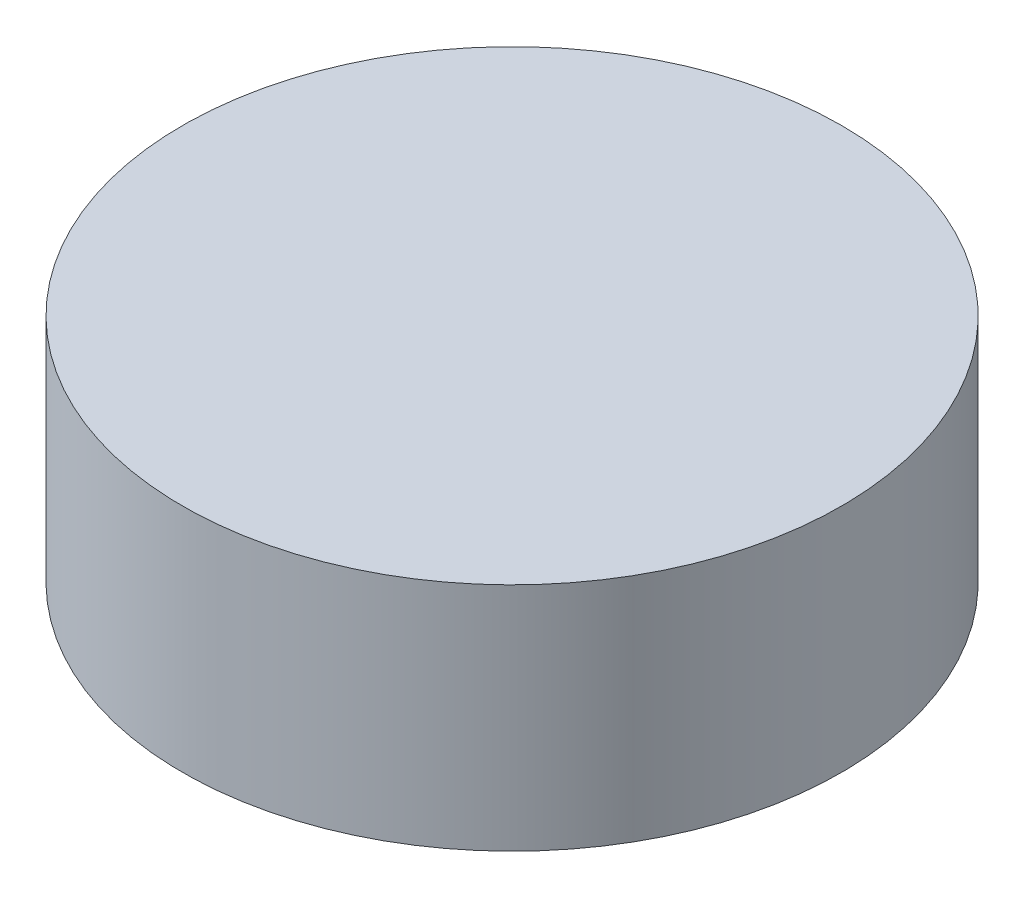
ISO-10303-21;
HEADER;
FILE_DESCRIPTION(('STEP AP214'),'2;1');
FILE_NAME('part.step','',(''),(''),'','','');
FILE_SCHEMA(('AUTOMOTIVE_DESIGN { 1 0 10303 214 1 1 1 1 }'));
ENDSEC;
DATA;
#1=APPLICATION_CONTEXT('core data for automotive mechanical design processes');
#2=APPLICATION_PROTOCOL_DEFINITION('international standard','automotive_design',2000,#1);
#3=PRODUCT_CONTEXT('',#1,'mechanical');
#4=PRODUCT('Part','Part','',(#3));
#5=PRODUCT_RELATED_PRODUCT_CATEGORY('part','',(#4));
#6=PRODUCT_DEFINITION_FORMATION('','',#4);
#7=PRODUCT_DEFINITION_CONTEXT('part definition',#1,'design');
#8=PRODUCT_DEFINITION('design','',#6,#7);
#9=PRODUCT_DEFINITION_SHAPE('','',#8);
#10=(LENGTH_UNIT() NAMED_UNIT(*) SI_UNIT(.MILLI.,.METRE.));
#11=(NAMED_UNIT(*) PLANE_ANGLE_UNIT() SI_UNIT($,.RADIAN.));
#12=(NAMED_UNIT(*) SI_UNIT($,.STERADIAN.) SOLID_ANGLE_UNIT());
#13=UNCERTAINTY_MEASURE_WITH_UNIT(LENGTH_MEASURE(1.E-05),#10,'distance_accuracy_value','');
#14=(GEOMETRIC_REPRESENTATION_CONTEXT(3) GLOBAL_UNCERTAINTY_ASSIGNED_CONTEXT((#13)) GLOBAL_UNIT_ASSIGNED_CONTEXT((#10,
#11,#12)) REPRESENTATION_CONTEXT('',''));
#15=CARTESIAN_POINT('',(0.,0.,0.));
#16=DIRECTION('',(0.,0.,1.));
#17=DIRECTION('',(1.,0.,0.));
#18=AXIS2_PLACEMENT_3D('',#15,#16,#17);
#19=CARTESIAN_POINT('',(-74.9999999999997,32.,-129.903810567666));
#20=DIRECTION('',(0.,-1.,0.));
#21=DIRECTION('',(0.,0.,-1.));
#22=AXIS2_PLACEMENT_3D('',#19,#20,#21);
#23=CYLINDRICAL_SURFACE('',#22,20.);
#24=CARTESIAN_POINT('',(-74.9999999999997,32.,-129.903810567666));
#25=DIRECTION('',(0.,1.,0.));
#26=DIRECTION('',(0.,0.,1.));
#27=AXIS2_PLACEMENT_3D('',#24,#25,#26);
#28=CIRCLE('',#27,20.);
#29=CARTESIAN_POINT('',(-74.9999999999997,32.,-149.903810567666));
#30=VERTEX_POINT('',#29);
#31=EDGE_CURVE('E10',#30,#30,#28,.T.);
#32=CARTESIAN_POINT('',(-74.9999999999997,18.,-129.903810567666));
#33=DIRECTION('',(0.,1.,0.));
#34=DIRECTION('',(0.,0.,1.));
#35=AXIS2_PLACEMENT_3D('',#32,#33,#34);
#36=CIRCLE('',#35,20.);
#37=CARTESIAN_POINT('',(-74.9999999999997,18.,-149.903810567666));
#38=VERTEX_POINT('',#37);
#39=EDGE_CURVE('E40',#38,#38,#36,.T.);
#40=CARTESIAN_POINT('',(-74.9999999999997,32.,-149.903810567666));
#41=CARTESIAN_POINT('',(-74.9999999999997,31.8541666666667,-149.903810567666));
#42=CARTESIAN_POINT('',(-74.9999999999997,31.7083333333333,-149.903810567666));
#43=CARTESIAN_POINT('',(-74.9999999999997,31.4166666666667,-149.903810567666));
#44=CARTESIAN_POINT('',(-74.9999999999997,31.2708333333333,-149.903810567666));
#45=CARTESIAN_POINT('',(-74.9999999999997,30.9791666666667,-149.903810567666));
#46=CARTESIAN_POINT('',(-74.9999999999997,30.8333333333333,-149.903810567666));
#47=CARTESIAN_POINT('',(-74.9999999999997,30.5416666666667,-149.903810567666));
#48=CARTESIAN_POINT('',(-74.9999999999997,30.3958333333333,-149.903810567666));
#49=CARTESIAN_POINT('',(-74.9999999999997,30.1041666666667,-149.903810567666));
#50=CARTESIAN_POINT('',(-74.9999999999997,29.9583333333333,-149.903810567666));
#51=CARTESIAN_POINT('',(-74.9999999999997,29.6666666666667,-149.903810567666));
#52=CARTESIAN_POINT('',(-74.9999999999997,29.5208333333333,-149.903810567666));
#53=CARTESIAN_POINT('',(-74.9999999999997,29.2291666666667,-149.903810567666));
#54=CARTESIAN_POINT('',(-74.9999999999997,29.0833333333333,-149.903810567666));
#55=CARTESIAN_POINT('',(-74.9999999999997,28.7916666666667,-149.903810567666));
#56=CARTESIAN_POINT('',(-74.9999999999997,28.6458333333333,-149.903810567666));
#57=CARTESIAN_POINT('',(-74.9999999999997,28.3541666666667,-149.903810567666));
#58=CARTESIAN_POINT('',(-74.9999999999997,28.2083333333333,-149.903810567666));
#59=CARTESIAN_POINT('',(-74.9999999999997,27.9166666666667,-149.903810567666));
#60=CARTESIAN_POINT('',(-74.9999999999997,27.7708333333333,-149.903810567666));
#61=CARTESIAN_POINT('',(-74.9999999999997,27.4791666666667,-149.903810567666));
#62=CARTESIAN_POINT('',(-74.9999999999997,27.3333333333333,-149.903810567666));
#63=CARTESIAN_POINT('',(-74.9999999999997,27.0416666666667,-149.903810567666));
#64=CARTESIAN_POINT('',(-74.9999999999997,26.8958333333333,-149.903810567666));
#65=CARTESIAN_POINT('',(-74.9999999999997,26.6041666666667,-149.903810567666));
#66=CARTESIAN_POINT('',(-74.9999999999997,26.4583333333333,-149.903810567666));
#67=CARTESIAN_POINT('',(-74.9999999999997,26.1666666666667,-149.903810567666));
#68=CARTESIAN_POINT('',(-74.9999999999997,26.0208333333333,-149.903810567666));
#69=CARTESIAN_POINT('',(-74.9999999999997,25.7291666666667,-149.903810567666));
#70=CARTESIAN_POINT('',(-74.9999999999997,25.5833333333333,-149.903810567666));
#71=CARTESIAN_POINT('',(-74.9999999999997,25.2916666666667,-149.903810567666));
#72=CARTESIAN_POINT('',(-74.9999999999997,25.1458333333333,-149.903810567666));
#73=CARTESIAN_POINT('',(-74.9999999999997,24.8541666666667,-149.903810567666));
#74=CARTESIAN_POINT('',(-74.9999999999997,24.7083333333333,-149.903810567666));
#75=CARTESIAN_POINT('',(-74.9999999999997,24.4166666666667,-149.903810567666));
#76=CARTESIAN_POINT('',(-74.9999999999997,24.2708333333333,-149.903810567666));
#77=CARTESIAN_POINT('',(-74.9999999999997,23.9791666666667,-149.903810567666));
#78=CARTESIAN_POINT('',(-74.9999999999997,23.8333333333333,-149.903810567666));
#79=CARTESIAN_POINT('',(-74.9999999999997,23.5416666666667,-149.903810567666));
#80=CARTESIAN_POINT('',(-74.9999999999997,23.3958333333333,-149.903810567666));
#81=CARTESIAN_POINT('',(-74.9999999999997,23.1041666666667,-149.903810567666));
#82=CARTESIAN_POINT('',(-74.9999999999997,22.9583333333333,-149.903810567666));
#83=CARTESIAN_POINT('',(-74.9999999999997,22.6666666666667,-149.903810567666));
#84=CARTESIAN_POINT('',(-74.9999999999997,22.5208333333333,-149.903810567666));
#85=CARTESIAN_POINT('',(-74.9999999999997,22.2291666666667,-149.903810567666));
#86=CARTESIAN_POINT('',(-74.9999999999997,22.0833333333333,-149.903810567666));
#87=CARTESIAN_POINT('',(-74.9999999999997,21.7916666666667,-149.903810567666));
#88=CARTESIAN_POINT('',(-74.9999999999997,21.6458333333333,-149.903810567666));
#89=CARTESIAN_POINT('',(-74.9999999999997,21.3541666666667,-149.903810567666));
#90=CARTESIAN_POINT('',(-74.9999999999997,21.2083333333333,-149.903810567666));
#91=CARTESIAN_POINT('',(-74.9999999999997,20.9166666666667,-149.903810567666));
#92=CARTESIAN_POINT('',(-74.9999999999997,20.7708333333333,-149.903810567666));
#93=CARTESIAN_POINT('',(-74.9999999999997,20.4791666666667,-149.903810567666));
#94=CARTESIAN_POINT('',(-74.9999999999997,20.3333333333333,-149.903810567666));
#95=CARTESIAN_POINT('',(-74.9999999999997,20.0416666666667,-149.903810567666));
#96=CARTESIAN_POINT('',(-74.9999999999997,19.8958333333333,-149.903810567666));
#97=CARTESIAN_POINT('',(-74.9999999999997,19.6041666666667,-149.903810567666));
#98=CARTESIAN_POINT('',(-74.9999999999997,19.4583333333333,-149.903810567666));
#99=CARTESIAN_POINT('',(-74.9999999999997,19.1666666666667,-149.903810567666));
#100=CARTESIAN_POINT('',(-74.9999999999997,19.0208333333333,-149.903810567666));
#101=CARTESIAN_POINT('',(-74.9999999999997,18.7291666666667,-149.903810567666));
#102=CARTESIAN_POINT('',(-74.9999999999997,18.5833333333333,-149.903810567666));
#103=CARTESIAN_POINT('',(-74.9999999999997,18.2916666666667,-149.903810567666));
#104=CARTESIAN_POINT('',(-74.9999999999997,18.1458333333333,-149.903810567666));
#105=CARTESIAN_POINT('',(-74.9999999999997,18.,-149.903810567666));
#106=B_SPLINE_CURVE_WITH_KNOTS('',3,(#40,#41,#42,#43,#44,#45,#46,#47,#48,#49,#50,#51,#52,#53,
#54,#55,#56,#57,#58,#59,#60,#61,#62,#63,#64,#65,#66,#67,#68,#69,#70,#71,#72,#73,#74,#75,#76,#77,
#78,#79,#80,#81,#82,#83,#84,#85,#86,#87,#88,#89,#90,#91,#92,#93,#94,#95,#96,#97,#98,#99,#100,
#101,#102,#103,#104,#105),.UNSPECIFIED.,.F.,.F.,(4,2,2,2,2,2,2,2,2,2,2,2,2,2,2,2,2,2,2,2,2,2,2,
2,2,2,2,2,2,2,2,2,4),(0.,0.4375,0.875000000000004,1.3125,1.75,2.1875,2.625,3.0625,3.5,3.9375,
4.375,4.8125,5.25,5.6875,6.125,6.5625,7.,7.4375,7.875,8.3125,8.75,9.1875,9.625,10.0625,10.5,
10.9375,11.375,11.8125,12.25,12.6875,13.125,13.5625,14.),.UNSPECIFIED.);
#107=EDGE_CURVE('BSEAM37',#30,#38,#106,.T.);
#108=ORIENTED_EDGE('',*,*,#31,.F.);
#109=ORIENTED_EDGE('',*,*,#39,.T.);
#110=ORIENTED_EDGE('',*,*,#107,.T.);
#111=ORIENTED_EDGE('',*,*,#107,.F.);
#112=EDGE_LOOP('',(#108,#110,#109,#111));
#113=FACE_BOUND('',#112,.T.);
#114=ADVANCED_FACE('F37',(#113),#23,.T.);
#115=CARTESIAN_POINT('',(-74.9999999999997,32.,-129.903810567666));
#116=DIRECTION('',(0.,1.,0.));
#117=DIRECTION('',(0.,0.,1.));
#118=AXIS2_PLACEMENT_3D('',#115,#116,#117);
#119=PLANE('',#118);
#120=ORIENTED_EDGE('',*,*,#31,.T.);
#121=EDGE_LOOP('',(#120));
#122=FACE_BOUND('',#121,.T.);
#123=ADVANCED_FACE('F54',(#122),#119,.T.);
#124=CARTESIAN_POINT('',(-74.9999999999997,18.,-129.903810567666));
#125=DIRECTION('',(0.,1.,0.));
#126=DIRECTION('',(0.,0.,1.));
#127=AXIS2_PLACEMENT_3D('',#124,#125,#126);
#128=PLANE('',#127);
#129=ORIENTED_EDGE('',*,*,#39,.F.);
#130=EDGE_LOOP('',(#129));
#131=FACE_BOUND('',#130,.T.);
#132=ADVANCED_FACE('F52',(#131),#128,.F.);
#133=CLOSED_SHELL('',(#114,#123,#132));
#134=MANIFOLD_SOLID_BREP('B2',#133);
#135=ADVANCED_BREP_SHAPE_REPRESENTATION('',(#18,#134),#14);
#136=SHAPE_DEFINITION_REPRESENTATION(#9,#135);
ENDSEC;
END-ISO-10303-21;
